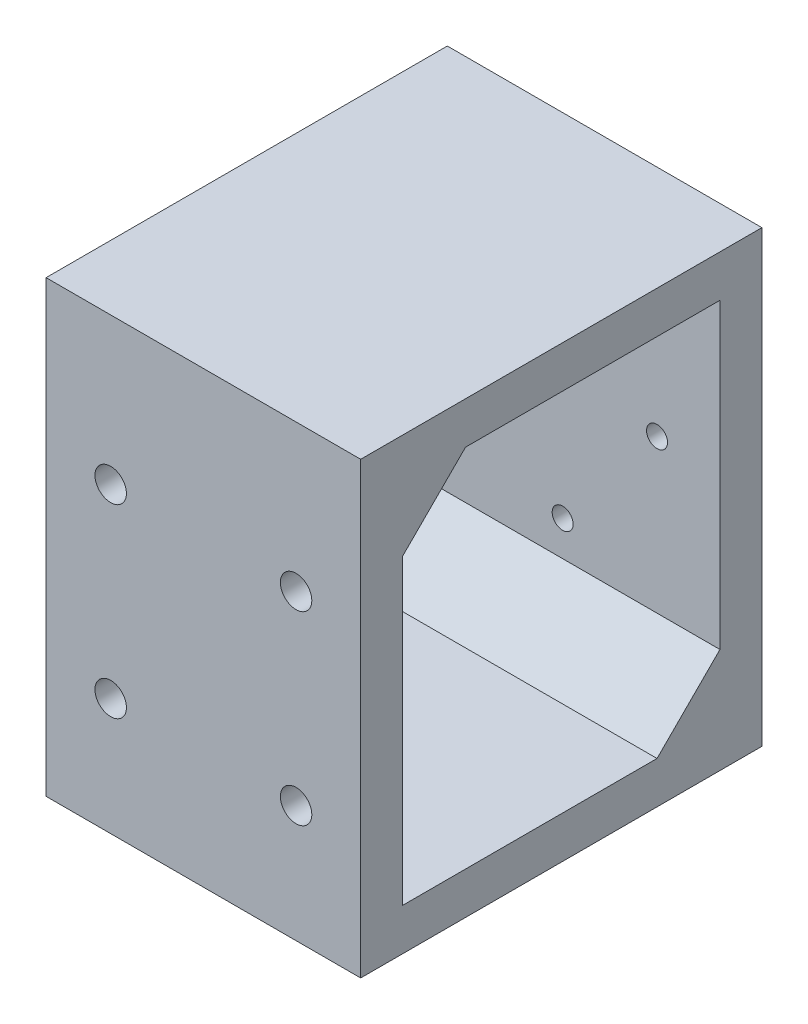
ISO-10303-21;
HEADER;
FILE_DESCRIPTION(('STEP AP214'),'2;1');
FILE_NAME('part.step','',(''),(''),'','','');
FILE_SCHEMA(('AUTOMOTIVE_DESIGN { 1 0 10303 214 1 1 1 1 }'));
ENDSEC;
DATA;
#1=APPLICATION_CONTEXT('core data for automotive mechanical design processes');
#2=APPLICATION_PROTOCOL_DEFINITION('international standard','automotive_design',2000,#1);
#3=PRODUCT_CONTEXT('',#1,'mechanical');
#4=PRODUCT('Part','Part','',(#3));
#5=PRODUCT_RELATED_PRODUCT_CATEGORY('part','',(#4));
#6=PRODUCT_DEFINITION_FORMATION('','',#4);
#7=PRODUCT_DEFINITION_CONTEXT('part definition',#1,'design');
#8=PRODUCT_DEFINITION('design','',#6,#7);
#9=PRODUCT_DEFINITION_SHAPE('','',#8);
#10=(LENGTH_UNIT() NAMED_UNIT(*) SI_UNIT(.MILLI.,.METRE.));
#11=(NAMED_UNIT(*) PLANE_ANGLE_UNIT() SI_UNIT($,.RADIAN.));
#12=(NAMED_UNIT(*) SI_UNIT($,.STERADIAN.) SOLID_ANGLE_UNIT());
#13=UNCERTAINTY_MEASURE_WITH_UNIT(LENGTH_MEASURE(1.E-05),#10,'distance_accuracy_value','');
#14=(GEOMETRIC_REPRESENTATION_CONTEXT(3) GLOBAL_UNCERTAINTY_ASSIGNED_CONTEXT((#13)) GLOBAL_UNIT_ASSIGNED_CONTEXT((#10,
#11,#12)) REPRESENTATION_CONTEXT('',''));
#15=CARTESIAN_POINT('',(0.,0.,0.));
#16=DIRECTION('',(0.,0.,1.));
#17=DIRECTION('',(1.,0.,0.));
#18=AXIS2_PLACEMENT_3D('',#15,#16,#17);
#19=CARTESIAN_POINT('',(-30.,0.,0.));
#20=DIRECTION('',(0.,0.,1.));
#21=DIRECTION('',(1.,0.,0.));
#22=AXIS2_PLACEMENT_3D('',#19,#20,#21);
#23=PLANE('',#22);
#24=CARTESIAN_POINT('',(17.6776695296638,57.6776695296636,0.));
#25=DIRECTION('',(0.,0.,1.));
#26=DIRECTION('',(1.,0.,0.));
#27=AXIS2_PLACEMENT_3D('',#24,#25,#26);
#28=CIRCLE('',#27,2.99999999999977);
#29=CARTESIAN_POINT('',(20.6776695296635,57.6776695296636,0.));
#30=VERTEX_POINT('',#29);
#31=EDGE_CURVE('E293',#30,#30,#28,.T.);
#32=ORIENTED_EDGE('',*,*,#31,.F.);
#33=EDGE_LOOP('',(#32));
#34=FACE_BOUND('',#33,.T.);
#35=CARTESIAN_POINT('',(-17.6776695296636,57.6776695296638,0.));
#36=DIRECTION('',(0.,0.,1.));
#37=DIRECTION('',(1.,0.,0.));
#38=AXIS2_PLACEMENT_3D('',#35,#36,#37);
#39=CIRCLE('',#38,2.99999999999984);
#40=CARTESIAN_POINT('',(-14.6776695296638,57.6776695296638,0.));
#41=VERTEX_POINT('',#40);
#42=EDGE_CURVE('E280',#41,#41,#39,.T.);
#43=ORIENTED_EDGE('',*,*,#42,.F.);
#44=EDGE_LOOP('',(#43));
#45=FACE_BOUND('',#44,.T.);
#46=CARTESIAN_POINT('',(-17.6776695296639,22.3223304703365,0.));
#47=DIRECTION('',(0.,0.,1.));
#48=DIRECTION('',(1.,0.,0.));
#49=AXIS2_PLACEMENT_3D('',#46,#47,#48);
#50=CIRCLE('',#49,3.);
#51=CARTESIAN_POINT('',(-14.6776695296639,22.3223304703365,0.));
#52=VERTEX_POINT('',#51);
#53=EDGE_CURVE('E278',#52,#52,#50,.T.);
#54=ORIENTED_EDGE('',*,*,#53,.F.);
#55=EDGE_LOOP('',(#54));
#56=FACE_BOUND('',#55,.T.);
#57=CARTESIAN_POINT('',(17.6776695296636,22.3223304703362,0.));
#58=DIRECTION('',(0.,0.,1.));
#59=DIRECTION('',(1.,0.,0.));
#60=AXIS2_PLACEMENT_3D('',#57,#58,#59);
#61=CIRCLE('',#60,3.);
#62=CARTESIAN_POINT('',(20.6776695296636,22.3223304703362,0.));
#63=VERTEX_POINT('',#62);
#64=EDGE_CURVE('E240',#63,#63,#61,.T.);
#65=ORIENTED_EDGE('',*,*,#64,.F.);
#66=EDGE_LOOP('',(#65));
#67=FACE_BOUND('',#66,.T.);
#68=DIRECTION('',(1.,0.,0.));
#69=VECTOR('',#68,1.);
#70=CARTESIAN_POINT('',(-30.,0.,0.));
#71=LINE('',#70,#69);
#72=CARTESIAN_POINT('',(-30.,0.,0.));
#73=VERTEX_POINT('',#72);
#74=CARTESIAN_POINT('',(30.,0.,0.));
#75=VERTEX_POINT('',#74);
#76=EDGE_CURVE('E208',#73,#75,#71,.T.);
#77=ORIENTED_EDGE('',*,*,#76,.T.);
#78=DIRECTION('',(0.,-1.,0.));
#79=VECTOR('',#78,1.);
#80=CARTESIAN_POINT('',(30.,0.,0.));
#81=LINE('',#80,#79);
#82=CARTESIAN_POINT('',(30.,85.68,0.));
#83=VERTEX_POINT('',#82);
#84=EDGE_CURVE('E162',#83,#75,#81,.T.);
#85=ORIENTED_EDGE('',*,*,#84,.F.);
#86=DIRECTION('',(1.,0.,0.));
#87=VECTOR('',#86,1.);
#88=CARTESIAN_POINT('',(-30.,85.68,0.));
#89=LINE('',#88,#87);
#90=CARTESIAN_POINT('',(-30.,85.68,0.));
#91=VERTEX_POINT('',#90);
#92=EDGE_CURVE('E209',#91,#83,#89,.T.);
#93=ORIENTED_EDGE('',*,*,#92,.F.);
#94=DIRECTION('',(0.,-1.,0.));
#95=VECTOR('',#94,1.);
#96=CARTESIAN_POINT('',(-30.,0.,0.));
#97=LINE('',#96,#95);
#98=EDGE_CURVE('E191',#91,#73,#97,.T.);
#99=ORIENTED_EDGE('',*,*,#98,.T.);
#100=EDGE_LOOP('',(#77,#85,#93,#99));
#101=FACE_BOUND('',#100,.T.);
#102=ADVANCED_FACE('F51',(#34,#45,#56,#67,#101),#23,.T.);
#103=CARTESIAN_POINT('',(-30.,85.68,0.));
#104=DIRECTION('',(0.,1.,0.));
#105=DIRECTION('',(0.,0.,1.));
#106=AXIS2_PLACEMENT_3D('',#103,#104,#105);
#107=PLANE('',#106);
#108=ORIENTED_EDGE('',*,*,#92,.T.);
#109=DIRECTION('',(0.,0.,1.));
#110=VECTOR('',#109,1.);
#111=CARTESIAN_POINT('',(30.,85.68,0.));
#112=LINE('',#111,#110);
#113=CARTESIAN_POINT('',(30.,85.68,-76.52));
#114=VERTEX_POINT('',#113);
#115=EDGE_CURVE('E174',#114,#83,#112,.T.);
#116=ORIENTED_EDGE('',*,*,#115,.F.);
#117=DIRECTION('',(1.,0.,0.));
#118=VECTOR('',#117,1.);
#119=CARTESIAN_POINT('',(-30.,85.68,-76.52));
#120=LINE('',#119,#118);
#121=CARTESIAN_POINT('',(-30.,85.68,-76.52));
#122=VERTEX_POINT('',#121);
#123=EDGE_CURVE('E212',#122,#114,#120,.T.);
#124=ORIENTED_EDGE('',*,*,#123,.F.);
#125=DIRECTION('',(0.,0.,1.));
#126=VECTOR('',#125,1.);
#127=CARTESIAN_POINT('',(-30.,85.68,0.));
#128=LINE('',#127,#126);
#129=EDGE_CURVE('E204',#122,#91,#128,.T.);
#130=ORIENTED_EDGE('',*,*,#129,.T.);
#131=EDGE_LOOP('',(#108,#116,#124,#130));
#132=FACE_BOUND('',#131,.T.);
#133=ADVANCED_FACE('F306',(#132),#107,.T.);
#134=CARTESIAN_POINT('',(-30.,0.,-76.52));
#135=DIRECTION('',(0.,0.,-1.));
#136=DIRECTION('',(-1.,0.,0.));
#137=AXIS2_PLACEMENT_3D('',#134,#135,#136);
#138=PLANE('',#137);
#139=CARTESIAN_POINT('',(0.,71.68,-76.52));
#140=DIRECTION('',(0.,0.,-1.));
#141=DIRECTION('',(-1.,0.,0.));
#142=AXIS2_PLACEMENT_3D('',#139,#140,#141);
#143=CIRCLE('',#142,2.);
#144=CARTESIAN_POINT('',(-1.99999999999999,71.68,-76.52));
#145=VERTEX_POINT('',#144);
#146=EDGE_CURVE('E224',#145,#145,#143,.T.);
#147=ORIENTED_EDGE('',*,*,#146,.F.);
#148=EDGE_LOOP('',(#147));
#149=FACE_BOUND('',#148,.T.);
#150=CARTESIAN_POINT('',(-18.,49.18,-76.52));
#151=DIRECTION('',(0.,0.,-1.));
#152=DIRECTION('',(-1.,0.,0.));
#153=AXIS2_PLACEMENT_3D('',#150,#151,#152);
#154=CIRCLE('',#153,2.);
#155=CARTESIAN_POINT('',(-20.,49.18,-76.52));
#156=VERTEX_POINT('',#155);
#157=EDGE_CURVE('E276',#156,#156,#154,.T.);
#158=ORIENTED_EDGE('',*,*,#157,.F.);
#159=EDGE_LOOP('',(#158));
#160=FACE_BOUND('',#159,.T.);
#161=CARTESIAN_POINT('',(0.,26.68,-76.52));
#162=DIRECTION('',(0.,0.,-1.));
#163=DIRECTION('',(-1.,0.,0.));
#164=AXIS2_PLACEMENT_3D('',#161,#162,#163);
#165=CIRCLE('',#164,2.);
#166=CARTESIAN_POINT('',(-2.00000000000001,26.68,-76.52));
#167=VERTEX_POINT('',#166);
#168=EDGE_CURVE('E272',#167,#167,#165,.T.);
#169=ORIENTED_EDGE('',*,*,#168,.F.);
#170=EDGE_LOOP('',(#169));
#171=FACE_BOUND('',#170,.T.);
#172=CARTESIAN_POINT('',(18.,49.18,-76.52));
#173=DIRECTION('',(0.,0.,-1.));
#174=DIRECTION('',(-1.,0.,0.));
#175=AXIS2_PLACEMENT_3D('',#172,#173,#174);
#176=CIRCLE('',#175,2.);
#177=CARTESIAN_POINT('',(16.,49.18,-76.52));
#178=VERTEX_POINT('',#177);
#179=EDGE_CURVE('E252',#178,#178,#176,.T.);
#180=ORIENTED_EDGE('',*,*,#179,.F.);
#181=EDGE_LOOP('',(#180));
#182=FACE_BOUND('',#181,.T.);
#183=ORIENTED_EDGE('',*,*,#123,.T.);
#184=DIRECTION('',(0.,1.,0.));
#185=VECTOR('',#184,1.);
#186=CARTESIAN_POINT('',(30.,0.,-76.52));
#187=LINE('',#186,#185);
#188=CARTESIAN_POINT('',(30.,0.,-76.52));
#189=VERTEX_POINT('',#188);
#190=EDGE_CURVE('E170',#189,#114,#187,.T.);
#191=ORIENTED_EDGE('',*,*,#190,.F.);
#192=DIRECTION('',(1.,0.,0.));
#193=VECTOR('',#192,1.);
#194=CARTESIAN_POINT('',(-30.,0.,-76.52));
#195=LINE('',#194,#193);
#196=CARTESIAN_POINT('',(-30.,0.,-76.52));
#197=VERTEX_POINT('',#196);
#198=EDGE_CURVE('E215',#197,#189,#195,.T.);
#199=ORIENTED_EDGE('',*,*,#198,.F.);
#200=DIRECTION('',(0.,1.,0.));
#201=VECTOR('',#200,1.);
#202=CARTESIAN_POINT('',(-30.,0.,-76.52));
#203=LINE('',#202,#201);
#204=EDGE_CURVE('E200',#197,#122,#203,.T.);
#205=ORIENTED_EDGE('',*,*,#204,.T.);
#206=EDGE_LOOP('',(#183,#191,#199,#205));
#207=FACE_BOUND('',#206,.T.);
#208=ADVANCED_FACE('F328',(#149,#160,#171,#182,#207),#138,.T.);
#209=CARTESIAN_POINT('',(-30.,0.,0.));
#210=DIRECTION('',(0.,-1.,0.));
#211=DIRECTION('',(0.,0.,-1.));
#212=AXIS2_PLACEMENT_3D('',#209,#210,#211);
#213=PLANE('',#212);
#214=ORIENTED_EDGE('',*,*,#198,.T.);
#215=DIRECTION('',(0.,0.,-1.));
#216=VECTOR('',#215,1.);
#217=CARTESIAN_POINT('',(30.,0.,0.));
#218=LINE('',#217,#216);
#219=EDGE_CURVE('E166',#75,#189,#218,.T.);
#220=ORIENTED_EDGE('',*,*,#219,.F.);
#221=ORIENTED_EDGE('',*,*,#76,.F.);
#222=DIRECTION('',(0.,0.,-1.));
#223=VECTOR('',#222,1.);
#224=CARTESIAN_POINT('',(-30.,0.,0.));
#225=LINE('',#224,#223);
#226=EDGE_CURVE('E196',#73,#197,#225,.T.);
#227=ORIENTED_EDGE('',*,*,#226,.T.);
#228=EDGE_LOOP('',(#214,#220,#221,#227));
#229=FACE_BOUND('',#228,.T.);
#230=ADVANCED_FACE('F318',(#229),#213,.T.);
#231=CARTESIAN_POINT('',(-30.,0.,0.));
#232=DIRECTION('',(-1.,0.,0.));
#233=DIRECTION('',(0.,0.,1.));
#234=AXIS2_PLACEMENT_3D('',#231,#232,#233);
#235=PLANE('',#234);
#236=DIRECTION('',(0.,0.,1.));
#237=VECTOR('',#236,1.);
#238=CARTESIAN_POINT('',(-30.,77.68,-8.));
#239=LINE('',#238,#237);
#240=CARTESIAN_POINT('',(-30.,77.68,-68.52));
#241=VERTEX_POINT('',#240);
#242=CARTESIAN_POINT('',(-30.,77.68,-19.9999999999999));
#243=VERTEX_POINT('',#242);
#244=EDGE_CURVE('E146',#241,#243,#239,.T.);
#245=ORIENTED_EDGE('',*,*,#244,.T.);
#246=DIRECTION('',(0.,0.707106781186551,-0.707106781186544));
#247=VECTOR('',#246,1.);
#248=CARTESIAN_POINT('',(-30.,65.6799999999999,-8.));
#249=LINE('',#248,#247);
#250=CARTESIAN_POINT('',(-30.,65.6799999999999,-8.));
#251=VERTEX_POINT('',#250);
#252=EDGE_CURVE('E267',#243,#251,#249,.F.);
#253=ORIENTED_EDGE('',*,*,#252,.T.);
#254=DIRECTION('',(0.,-1.,0.));
#255=VECTOR('',#254,1.);
#256=CARTESIAN_POINT('',(-30.,77.68,-8.));
#257=LINE('',#256,#255);
#258=CARTESIAN_POINT('',(-30.,8.,-8.00000000000001));
#259=VERTEX_POINT('',#258);
#260=EDGE_CURVE('E178',#251,#259,#257,.T.);
#261=ORIENTED_EDGE('',*,*,#260,.T.);
#262=DIRECTION('',(0.,0.,-1.));
#263=VECTOR('',#262,1.);
#264=CARTESIAN_POINT('',(-30.,8.,-8.00000000000001));
#265=LINE('',#264,#263);
#266=CARTESIAN_POINT('',(-30.,8.,-56.52));
#267=VERTEX_POINT('',#266);
#268=EDGE_CURVE('E143',#259,#267,#265,.T.);
#269=ORIENTED_EDGE('',*,*,#268,.T.);
#270=DIRECTION('',(0.,-0.707106781186551,0.707106781186544));
#271=VECTOR('',#270,1.);
#272=CARTESIAN_POINT('',(-30.,20.0000000000001,-68.52));
#273=LINE('',#272,#271);
#274=CARTESIAN_POINT('',(-30.,20.0000000000001,-68.52));
#275=VERTEX_POINT('',#274);
#276=EDGE_CURVE('E11',#267,#275,#273,.F.);
#277=ORIENTED_EDGE('',*,*,#276,.T.);
#278=DIRECTION('',(0.,1.,0.));
#279=VECTOR('',#278,1.);
#280=CARTESIAN_POINT('',(-30.,77.68,-68.52));
#281=LINE('',#280,#279);
#282=EDGE_CURVE('E183',#275,#241,#281,.T.);
#283=ORIENTED_EDGE('',*,*,#282,.T.);
#284=EDGE_LOOP('',(#245,#253,#261,#269,#277,#283));
#285=FACE_BOUND('',#284,.T.);
#286=ORIENTED_EDGE('',*,*,#98,.F.);
#287=ORIENTED_EDGE('',*,*,#129,.F.);
#288=ORIENTED_EDGE('',*,*,#204,.F.);
#289=ORIENTED_EDGE('',*,*,#226,.F.);
#290=EDGE_LOOP('',(#286,#287,#288,#289));
#291=FACE_BOUND('',#290,.T.);
#292=ADVANCED_FACE('F325',(#285,#291),#235,.T.);
#293=CARTESIAN_POINT('',(-30.,77.68,-8.));
#294=DIRECTION('',(0.,0.,1.));
#295=DIRECTION('',(0.,-1.,0.));
#296=AXIS2_PLACEMENT_3D('',#293,#294,#295);
#297=PLANE('',#296);
#298=CARTESIAN_POINT('',(17.6776695296638,57.6776695296636,-8.));
#299=DIRECTION('',(0.,0.,1.));
#300=DIRECTION('',(0.,-1.,0.));
#301=AXIS2_PLACEMENT_3D('',#298,#299,#300);
#302=CIRCLE('',#301,2.99999999999977);
#303=CARTESIAN_POINT('',(17.6776695296638,54.6776695296638,-8.));
#304=VERTEX_POINT('',#303);
#305=EDGE_CURVE('E248',#304,#304,#302,.T.);
#306=ORIENTED_EDGE('',*,*,#305,.T.);
#307=EDGE_LOOP('',(#306));
#308=FACE_BOUND('',#307,.T.);
#309=CARTESIAN_POINT('',(-17.6776695296636,57.6776695296638,-8.));
#310=DIRECTION('',(0.,0.,1.));
#311=DIRECTION('',(0.,-1.,0.));
#312=AXIS2_PLACEMENT_3D('',#309,#310,#311);
#313=CIRCLE('',#312,2.99999999999984);
#314=CARTESIAN_POINT('',(-17.6776695296636,54.6776695296639,-8.));
#315=VERTEX_POINT('',#314);
#316=EDGE_CURVE('E244',#315,#315,#313,.T.);
#317=ORIENTED_EDGE('',*,*,#316,.T.);
#318=EDGE_LOOP('',(#317));
#319=FACE_BOUND('',#318,.T.);
#320=CARTESIAN_POINT('',(-17.6776695296639,22.3223304703365,-8.));
#321=DIRECTION('',(0.,0.,1.));
#322=DIRECTION('',(0.,-1.,0.));
#323=AXIS2_PLACEMENT_3D('',#320,#321,#322);
#324=CIRCLE('',#323,3.);
#325=CARTESIAN_POINT('',(-17.6776695296639,19.3223304703365,-8.));
#326=VERTEX_POINT('',#325);
#327=EDGE_CURVE('E239',#326,#326,#324,.T.);
#328=ORIENTED_EDGE('',*,*,#327,.T.);
#329=EDGE_LOOP('',(#328));
#330=FACE_BOUND('',#329,.T.);
#331=CARTESIAN_POINT('',(17.6776695296636,22.3223304703362,-8.));
#332=DIRECTION('',(0.,0.,1.));
#333=DIRECTION('',(0.,-1.,0.));
#334=AXIS2_PLACEMENT_3D('',#331,#332,#333);
#335=CIRCLE('',#334,3.);
#336=CARTESIAN_POINT('',(17.6776695296636,19.3223304703362,-8.));
#337=VERTEX_POINT('',#336);
#338=EDGE_CURVE('E235',#337,#337,#335,.T.);
#339=ORIENTED_EDGE('',*,*,#338,.T.);
#340=EDGE_LOOP('',(#339));
#341=FACE_BOUND('',#340,.T.);
#342=ORIENTED_EDGE('',*,*,#260,.F.);
#343=DIRECTION('',(1.,0.,0.));
#344=VECTOR('',#343,1.);
#345=CARTESIAN_POINT('',(30.,65.6799999999999,-8.));
#346=LINE('',#345,#344);
#347=CARTESIAN_POINT('',(30.,65.6799999999999,-8.));
#348=VERTEX_POINT('',#347);
#349=EDGE_CURVE('E137',#251,#348,#346,.T.);
#350=ORIENTED_EDGE('',*,*,#349,.T.);
#351=DIRECTION('',(0.,-1.,0.));
#352=VECTOR('',#351,1.);
#353=CARTESIAN_POINT('',(30.,77.68,-8.));
#354=LINE('',#353,#352);
#355=CARTESIAN_POINT('',(30.,8.,-8.00000000000001));
#356=VERTEX_POINT('',#355);
#357=EDGE_CURVE('E131',#348,#356,#354,.T.);
#358=ORIENTED_EDGE('',*,*,#357,.T.);
#359=DIRECTION('',(1.,0.,0.));
#360=VECTOR('',#359,1.);
#361=CARTESIAN_POINT('',(-30.,8.,-8.00000000000001));
#362=LINE('',#361,#360);
#363=EDGE_CURVE('E135',#259,#356,#362,.T.);
#364=ORIENTED_EDGE('',*,*,#363,.F.);
#365=EDGE_LOOP('',(#342,#350,#358,#364));
#366=FACE_BOUND('',#365,.T.);
#367=ADVANCED_FACE('F134',(#308,#319,#330,#341,#366),#297,.F.);
#368=CARTESIAN_POINT('',(-30.,77.68,-8.));
#369=DIRECTION('',(0.,1.,0.));
#370=DIRECTION('',(0.,0.,1.));
#371=AXIS2_PLACEMENT_3D('',#368,#369,#370);
#372=PLANE('',#371);
#373=DIRECTION('',(0.,0.,1.));
#374=VECTOR('',#373,1.);
#375=CARTESIAN_POINT('',(30.,77.68,-8.));
#376=LINE('',#375,#374);
#377=CARTESIAN_POINT('',(30.,77.68,-68.52));
#378=VERTEX_POINT('',#377);
#379=CARTESIAN_POINT('',(30.,77.68,-19.9999999999999));
#380=VERTEX_POINT('',#379);
#381=EDGE_CURVE('E155',#378,#380,#376,.T.);
#382=ORIENTED_EDGE('',*,*,#381,.T.);
#383=DIRECTION('',(-1.,0.,0.));
#384=VECTOR('',#383,1.);
#385=CARTESIAN_POINT('',(-30.,77.68,-20.));
#386=LINE('',#385,#384);
#387=EDGE_CURVE('E255',#380,#243,#386,.T.);
#388=ORIENTED_EDGE('',*,*,#387,.T.);
#389=ORIENTED_EDGE('',*,*,#244,.F.);
#390=DIRECTION('',(1.,0.,0.));
#391=VECTOR('',#390,1.);
#392=CARTESIAN_POINT('',(-30.,77.68,-68.52));
#393=LINE('',#392,#391);
#394=EDGE_CURVE('E145',#241,#378,#393,.T.);
#395=ORIENTED_EDGE('',*,*,#394,.T.);
#396=EDGE_LOOP('',(#382,#388,#389,#395));
#397=FACE_BOUND('',#396,.T.);
#398=ADVANCED_FACE('F359',(#397),#372,.F.);
#399=CARTESIAN_POINT('',(-30.,77.68,-68.52));
#400=DIRECTION('',(0.,0.,-1.));
#401=DIRECTION('',(-1.,0.,0.));
#402=AXIS2_PLACEMENT_3D('',#399,#400,#401);
#403=PLANE('',#402);
#404=CARTESIAN_POINT('',(0.,71.68,-68.52));
#405=DIRECTION('',(0.,0.,-1.));
#406=DIRECTION('',(-1.,0.,0.));
#407=AXIS2_PLACEMENT_3D('',#404,#405,#406);
#408=CIRCLE('',#407,2.);
#409=CARTESIAN_POINT('',(-1.99999999999999,71.68,-68.52));
#410=VERTEX_POINT('',#409);
#411=EDGE_CURVE('E140',#410,#410,#408,.T.);
#412=ORIENTED_EDGE('',*,*,#411,.T.);
#413=EDGE_LOOP('',(#412));
#414=FACE_BOUND('',#413,.T.);
#415=CARTESIAN_POINT('',(-18.,49.18,-68.52));
#416=DIRECTION('',(0.,0.,-1.));
#417=DIRECTION('',(-1.,0.,0.));
#418=AXIS2_PLACEMENT_3D('',#415,#416,#417);
#419=CIRCLE('',#418,2.);
#420=CARTESIAN_POINT('',(-20.,49.18,-68.52));
#421=VERTEX_POINT('',#420);
#422=EDGE_CURVE('E228',#421,#421,#419,.T.);
#423=ORIENTED_EDGE('',*,*,#422,.T.);
#424=EDGE_LOOP('',(#423));
#425=FACE_BOUND('',#424,.T.);
#426=CARTESIAN_POINT('',(0.,26.68,-68.52));
#427=DIRECTION('',(0.,0.,-1.));
#428=DIRECTION('',(-1.,0.,0.));
#429=AXIS2_PLACEMENT_3D('',#426,#427,#428);
#430=CIRCLE('',#429,2.);
#431=CARTESIAN_POINT('',(-2.00000000000001,26.68,-68.52));
#432=VERTEX_POINT('',#431);
#433=EDGE_CURVE('E223',#432,#432,#430,.T.);
#434=ORIENTED_EDGE('',*,*,#433,.T.);
#435=EDGE_LOOP('',(#434));
#436=FACE_BOUND('',#435,.T.);
#437=CARTESIAN_POINT('',(18.,49.18,-68.52));
#438=DIRECTION('',(0.,0.,-1.));
#439=DIRECTION('',(-1.,0.,0.));
#440=AXIS2_PLACEMENT_3D('',#437,#438,#439);
#441=CIRCLE('',#440,2.);
#442=CARTESIAN_POINT('',(16.,49.18,-68.52));
#443=VERTEX_POINT('',#442);
#444=EDGE_CURVE('E219',#443,#443,#441,.T.);
#445=ORIENTED_EDGE('',*,*,#444,.T.);
#446=EDGE_LOOP('',(#445));
#447=FACE_BOUND('',#446,.T.);
#448=ORIENTED_EDGE('',*,*,#282,.F.);
#449=DIRECTION('',(1.,0.,0.));
#450=VECTOR('',#449,1.);
#451=CARTESIAN_POINT('',(30.,20.0000000000001,-68.52));
#452=LINE('',#451,#450);
#453=CARTESIAN_POINT('',(30.,20.0000000000001,-68.52));
#454=VERTEX_POINT('',#453);
#455=EDGE_CURVE('E258',#275,#454,#452,.T.);
#456=ORIENTED_EDGE('',*,*,#455,.T.);
#457=DIRECTION('',(0.,1.,0.));
#458=VECTOR('',#457,1.);
#459=CARTESIAN_POINT('',(30.,77.68,-68.52));
#460=LINE('',#459,#458);
#461=EDGE_CURVE('E150',#454,#378,#460,.T.);
#462=ORIENTED_EDGE('',*,*,#461,.T.);
#463=ORIENTED_EDGE('',*,*,#394,.F.);
#464=EDGE_LOOP('',(#448,#456,#462,#463));
#465=FACE_BOUND('',#464,.T.);
#466=ADVANCED_FACE('F362',(#414,#425,#436,#447,#465),#403,.F.);
#467=CARTESIAN_POINT('',(-30.,8.,-8.00000000000001));
#468=DIRECTION('',(0.,-1.,0.));
#469=DIRECTION('',(0.,0.,-1.));
#470=AXIS2_PLACEMENT_3D('',#467,#468,#469);
#471=PLANE('',#470);
#472=DIRECTION('',(0.,0.,-1.));
#473=VECTOR('',#472,1.);
#474=CARTESIAN_POINT('',(30.,8.,-8.00000000000001));
#475=LINE('',#474,#473);
#476=CARTESIAN_POINT('',(30.,8.,-56.52));
#477=VERTEX_POINT('',#476);
#478=EDGE_CURVE('E139',#356,#477,#475,.T.);
#479=ORIENTED_EDGE('',*,*,#478,.T.);
#480=DIRECTION('',(-1.,0.,0.));
#481=VECTOR('',#480,1.);
#482=CARTESIAN_POINT('',(-30.,8.,-56.52));
#483=LINE('',#482,#481);
#484=EDGE_CURVE('E68',#477,#267,#483,.T.);
#485=ORIENTED_EDGE('',*,*,#484,.T.);
#486=ORIENTED_EDGE('',*,*,#268,.F.);
#487=ORIENTED_EDGE('',*,*,#363,.T.);
#488=EDGE_LOOP('',(#479,#485,#486,#487));
#489=FACE_BOUND('',#488,.T.);
#490=ADVANCED_FACE('F142',(#489),#471,.F.);
#491=CARTESIAN_POINT('',(30.,0.,0.));
#492=DIRECTION('',(-1.,0.,0.));
#493=DIRECTION('',(0.,0.,1.));
#494=AXIS2_PLACEMENT_3D('',#491,#492,#493);
#495=PLANE('',#494);
#496=ORIENTED_EDGE('',*,*,#84,.T.);
#497=ORIENTED_EDGE('',*,*,#219,.T.);
#498=ORIENTED_EDGE('',*,*,#190,.T.);
#499=ORIENTED_EDGE('',*,*,#115,.T.);
#500=EDGE_LOOP('',(#496,#497,#498,#499));
#501=FACE_BOUND('',#500,.T.);
#502=ORIENTED_EDGE('',*,*,#357,.F.);
#503=DIRECTION('',(0.,-0.707106781186551,0.707106781186544));
#504=VECTOR('',#503,1.);
#505=CARTESIAN_POINT('',(30.,28.8399999999996,28.8399999999999));
#506=LINE('',#505,#504);
#507=EDGE_CURVE('E264',#348,#380,#506,.F.);
#508=ORIENTED_EDGE('',*,*,#507,.T.);
#509=ORIENTED_EDGE('',*,*,#381,.F.);
#510=ORIENTED_EDGE('',*,*,#461,.F.);
#511=DIRECTION('',(0.,0.707106781186551,-0.707106781186544));
#512=VECTOR('',#511,1.);
#513=CARTESIAN_POINT('',(30.,-24.2600000000001,-24.2600000000003));
#514=LINE('',#513,#512);
#515=EDGE_CURVE('E61',#454,#477,#514,.F.);
#516=ORIENTED_EDGE('',*,*,#515,.T.);
#517=ORIENTED_EDGE('',*,*,#478,.F.);
#518=EDGE_LOOP('',(#502,#508,#509,#510,#516,#517));
#519=FACE_BOUND('',#518,.T.);
#520=ADVANCED_FACE('F148',(#501,#519),#495,.F.);
#521=CARTESIAN_POINT('',(18.,49.18,-46.52));
#522=DIRECTION('',(0.,0.,-1.));
#523=DIRECTION('',(-1.,0.,0.));
#524=AXIS2_PLACEMENT_3D('',#521,#522,#523);
#525=CYLINDRICAL_SURFACE('',#524,2.);
#526=ORIENTED_EDGE('',*,*,#179,.T.);
#527=EDGE_LOOP('',(#526));
#528=FACE_BOUND('',#527,.T.);
#529=ORIENTED_EDGE('',*,*,#444,.F.);
#530=EDGE_LOOP('',(#529));
#531=FACE_BOUND('',#530,.T.);
#532=ADVANCED_FACE('F408',(#528,#531),#525,.F.);
#533=CARTESIAN_POINT('',(0.,26.68,-46.52));
#534=DIRECTION('',(0.,0.,-1.));
#535=DIRECTION('',(-1.,0.,0.));
#536=AXIS2_PLACEMENT_3D('',#533,#534,#535);
#537=CYLINDRICAL_SURFACE('',#536,2.);
#538=ORIENTED_EDGE('',*,*,#168,.T.);
#539=EDGE_LOOP('',(#538));
#540=FACE_BOUND('',#539,.T.);
#541=ORIENTED_EDGE('',*,*,#433,.F.);
#542=EDGE_LOOP('',(#541));
#543=FACE_BOUND('',#542,.T.);
#544=ADVANCED_FACE('F475',(#540,#543),#537,.F.);
#545=CARTESIAN_POINT('',(-18.,49.18,-46.52));
#546=DIRECTION('',(0.,0.,-1.));
#547=DIRECTION('',(-1.,0.,0.));
#548=AXIS2_PLACEMENT_3D('',#545,#546,#547);
#549=CYLINDRICAL_SURFACE('',#548,2.);
#550=ORIENTED_EDGE('',*,*,#157,.T.);
#551=EDGE_LOOP('',(#550));
#552=FACE_BOUND('',#551,.T.);
#553=ORIENTED_EDGE('',*,*,#422,.F.);
#554=EDGE_LOOP('',(#553));
#555=FACE_BOUND('',#554,.T.);
#556=ADVANCED_FACE('F466',(#552,#555),#549,.F.);
#557=CARTESIAN_POINT('',(0.,71.68,-46.52));
#558=DIRECTION('',(0.,0.,-1.));
#559=DIRECTION('',(-1.,0.,0.));
#560=AXIS2_PLACEMENT_3D('',#557,#558,#559);
#561=CYLINDRICAL_SURFACE('',#560,2.);
#562=ORIENTED_EDGE('',*,*,#146,.T.);
#563=EDGE_LOOP('',(#562));
#564=FACE_BOUND('',#563,.T.);
#565=ORIENTED_EDGE('',*,*,#411,.F.);
#566=EDGE_LOOP('',(#565));
#567=FACE_BOUND('',#566,.T.);
#568=ADVANCED_FACE('F456',(#564,#567),#561,.F.);
#569=CARTESIAN_POINT('',(17.6776695296636,22.3223304703362,-30.));
#570=DIRECTION('',(0.,0.,1.));
#571=DIRECTION('',(1.,0.,0.));
#572=AXIS2_PLACEMENT_3D('',#569,#570,#571);
#573=CYLINDRICAL_SURFACE('',#572,3.);
#574=ORIENTED_EDGE('',*,*,#64,.T.);
#575=EDGE_LOOP('',(#574));
#576=FACE_BOUND('',#575,.T.);
#577=ORIENTED_EDGE('',*,*,#338,.F.);
#578=EDGE_LOOP('',(#577));
#579=FACE_BOUND('',#578,.T.);
#580=ADVANCED_FACE('F446',(#576,#579),#573,.F.);
#581=CARTESIAN_POINT('',(-17.6776695296639,22.3223304703365,-30.));
#582=DIRECTION('',(0.,0.,1.));
#583=DIRECTION('',(1.,0.,0.));
#584=AXIS2_PLACEMENT_3D('',#581,#582,#583);
#585=CYLINDRICAL_SURFACE('',#584,3.);
#586=ORIENTED_EDGE('',*,*,#53,.T.);
#587=EDGE_LOOP('',(#586));
#588=FACE_BOUND('',#587,.T.);
#589=ORIENTED_EDGE('',*,*,#327,.F.);
#590=EDGE_LOOP('',(#589));
#591=FACE_BOUND('',#590,.T.);
#592=ADVANCED_FACE('F437',(#588,#591),#585,.F.);
#593=CARTESIAN_POINT('',(-17.6776695296636,57.6776695296638,-30.));
#594=DIRECTION('',(0.,0.,1.));
#595=DIRECTION('',(1.,0.,0.));
#596=AXIS2_PLACEMENT_3D('',#593,#594,#595);
#597=CYLINDRICAL_SURFACE('',#596,2.99999999999984);
#598=ORIENTED_EDGE('',*,*,#42,.T.);
#599=EDGE_LOOP('',(#598));
#600=FACE_BOUND('',#599,.T.);
#601=ORIENTED_EDGE('',*,*,#316,.F.);
#602=EDGE_LOOP('',(#601));
#603=FACE_BOUND('',#602,.T.);
#604=ADVANCED_FACE('F301',(#600,#603),#597,.F.);
#605=CARTESIAN_POINT('',(17.6776695296638,57.6776695296636,-30.));
#606=DIRECTION('',(0.,0.,1.));
#607=DIRECTION('',(1.,0.,0.));
#608=AXIS2_PLACEMENT_3D('',#605,#606,#607);
#609=CYLINDRICAL_SURFACE('',#608,2.99999999999977);
#610=ORIENTED_EDGE('',*,*,#31,.T.);
#611=EDGE_LOOP('',(#610));
#612=FACE_BOUND('',#611,.T.);
#613=ORIENTED_EDGE('',*,*,#305,.F.);
#614=EDGE_LOOP('',(#613));
#615=FACE_BOUND('',#614,.T.);
#616=ADVANCED_FACE('F344',(#612,#615),#609,.F.);
#617=CARTESIAN_POINT('',(-30.,65.6799999999999,-8.));
#618=DIRECTION('',(0.,-0.707106781186544,-0.707106781186551));
#619=DIRECTION('',(-1.,0.,0.));
#620=AXIS2_PLACEMENT_3D('',#617,#618,#619);
#621=PLANE('',#620);
#622=ORIENTED_EDGE('',*,*,#252,.F.);
#623=ORIENTED_EDGE('',*,*,#387,.F.);
#624=ORIENTED_EDGE('',*,*,#507,.F.);
#625=ORIENTED_EDGE('',*,*,#349,.F.);
#626=EDGE_LOOP('',(#622,#623,#624,#625));
#627=FACE_BOUND('',#626,.T.);
#628=ADVANCED_FACE('F340',(#627),#621,.T.);
#629=CARTESIAN_POINT('',(-30.,20.0000000000001,-68.52));
#630=DIRECTION('',(0.,0.707106781186544,0.707106781186551));
#631=DIRECTION('',(-1.,0.,0.));
#632=AXIS2_PLACEMENT_3D('',#629,#630,#631);
#633=PLANE('',#632);
#634=ORIENTED_EDGE('',*,*,#276,.F.);
#635=ORIENTED_EDGE('',*,*,#484,.F.);
#636=ORIENTED_EDGE('',*,*,#515,.F.);
#637=ORIENTED_EDGE('',*,*,#455,.F.);
#638=EDGE_LOOP('',(#634,#635,#636,#637));
#639=FACE_BOUND('',#638,.T.);
#640=ADVANCED_FACE('F54',(#639),#633,.T.);
#641=CLOSED_SHELL('',(#102,#133,#208,#230,#292,#367,#398,#466,#490,#520,#532,#544,#556,#568,
#580,#592,#604,#616,#628,#640));
#642=MANIFOLD_SOLID_BREP('B2',#641);
#643=ADVANCED_BREP_SHAPE_REPRESENTATION('',(#18,#642),#14);
#644=SHAPE_DEFINITION_REPRESENTATION(#9,#643);
ENDSEC;
END-ISO-10303-21;
